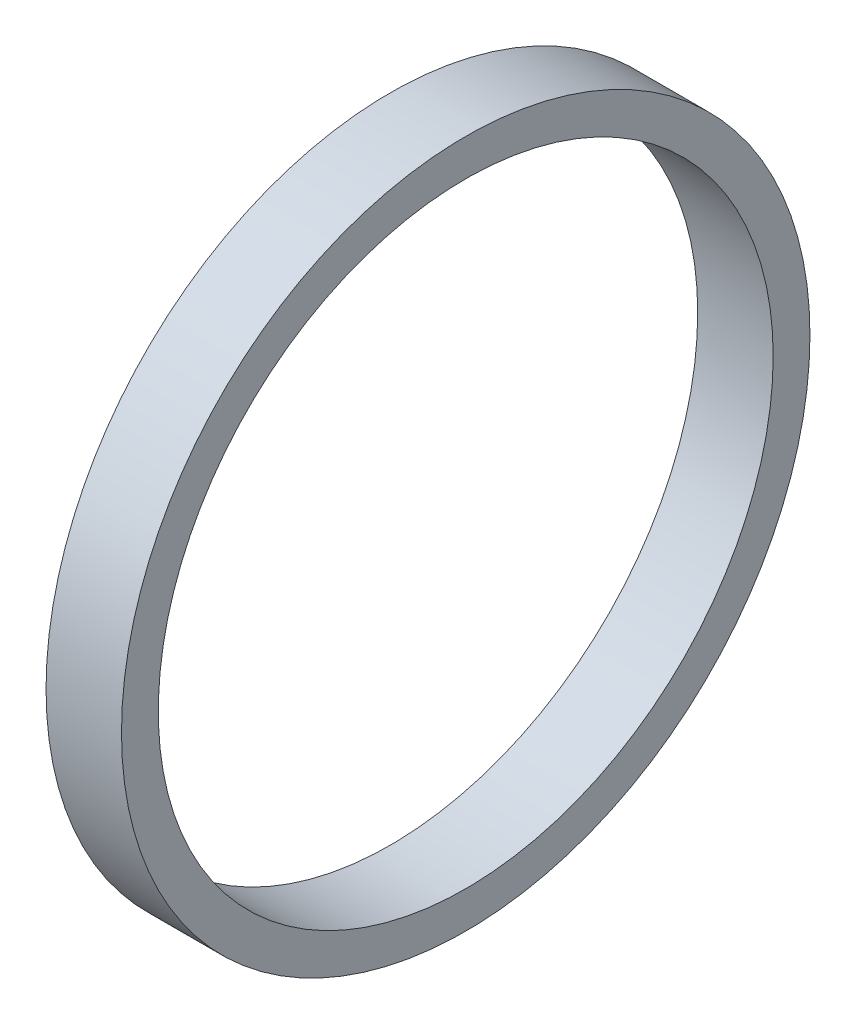
ISO-10303-21;
HEADER;
FILE_DESCRIPTION(('STEP AP214'),'2;1');
FILE_NAME('part.step','',(''),(''),'','','');
FILE_SCHEMA(('AUTOMOTIVE_DESIGN { 1 0 10303 214 1 1 1 1 }'));
ENDSEC;
DATA;
#1=APPLICATION_CONTEXT('core data for automotive mechanical design processes');
#2=APPLICATION_PROTOCOL_DEFINITION('international standard','automotive_design',2000,#1);
#3=PRODUCT_CONTEXT('',#1,'mechanical');
#4=PRODUCT('Part','Part','',(#3));
#5=PRODUCT_RELATED_PRODUCT_CATEGORY('part','',(#4));
#6=PRODUCT_DEFINITION_FORMATION('','',#4);
#7=PRODUCT_DEFINITION_CONTEXT('part definition',#1,'design');
#8=PRODUCT_DEFINITION('design','',#6,#7);
#9=PRODUCT_DEFINITION_SHAPE('','',#8);
#10=(LENGTH_UNIT() NAMED_UNIT(*) SI_UNIT(.MILLI.,.METRE.));
#11=(NAMED_UNIT(*) PLANE_ANGLE_UNIT() SI_UNIT($,.RADIAN.));
#12=(NAMED_UNIT(*) SI_UNIT($,.STERADIAN.) SOLID_ANGLE_UNIT());
#13=UNCERTAINTY_MEASURE_WITH_UNIT(LENGTH_MEASURE(1.E-05),#10,'distance_accuracy_value','');
#14=(GEOMETRIC_REPRESENTATION_CONTEXT(3) GLOBAL_UNCERTAINTY_ASSIGNED_CONTEXT((#13)) GLOBAL_UNIT_ASSIGNED_CONTEXT((#10,
#11,#12)) REPRESENTATION_CONTEXT('',''));
#15=CARTESIAN_POINT('',(0.,0.,0.));
#16=DIRECTION('',(0.,0.,1.));
#17=DIRECTION('',(1.,0.,0.));
#18=AXIS2_PLACEMENT_3D('',#15,#16,#17);
#19=CARTESIAN_POINT('',(8.,0.,0.));
#20=DIRECTION('',(1.,0.,0.));
#21=DIRECTION('',(0.,0.,-1.));
#22=AXIS2_PLACEMENT_3D('',#19,#20,#21);
#23=PLANE('',#22);
#24=CARTESIAN_POINT('',(8.,0.,0.));
#25=DIRECTION('',(1.,0.,0.));
#26=DIRECTION('',(0.,0.,-1.));
#27=AXIS2_PLACEMENT_3D('',#24,#25,#26);
#28=CIRCLE('',#27,36.5);
#29=CARTESIAN_POINT('',(8.,0.,-36.5));
#30=VERTEX_POINT('',#29);
#31=EDGE_CURVE('E10',#30,#30,#28,.T.);
#32=ORIENTED_EDGE('',*,*,#31,.T.);
#33=EDGE_LOOP('',(#32));
#34=FACE_BOUND('',#33,.T.);
#35=CARTESIAN_POINT('',(8.,0.,0.));
#36=DIRECTION('',(1.,0.,0.));
#37=DIRECTION('',(0.,0.,-1.));
#38=AXIS2_PLACEMENT_3D('',#35,#36,#37);
#39=CIRCLE('',#38,32.6);
#40=CARTESIAN_POINT('',(8.,0.,-32.6));
#41=VERTEX_POINT('',#40);
#42=EDGE_CURVE('E48',#41,#41,#39,.T.);
#43=ORIENTED_EDGE('',*,*,#42,.F.);
#44=EDGE_LOOP('',(#43));
#45=FACE_BOUND('',#44,.T.);
#46=ADVANCED_FACE('F37',(#34,#45),#23,.T.);
#47=CARTESIAN_POINT('',(0.,0.,0.));
#48=DIRECTION('',(1.,0.,0.));
#49=DIRECTION('',(0.,0.,-1.));
#50=AXIS2_PLACEMENT_3D('',#47,#48,#49);
#51=PLANE('',#50);
#52=CARTESIAN_POINT('',(0.,0.,0.));
#53=DIRECTION('',(1.,0.,0.));
#54=DIRECTION('',(0.,0.,-1.));
#55=AXIS2_PLACEMENT_3D('',#52,#53,#54);
#56=CIRCLE('',#55,36.5);
#57=CARTESIAN_POINT('',(0.,0.,-36.5));
#58=VERTEX_POINT('',#57);
#59=EDGE_CURVE('E41',#58,#58,#56,.T.);
#60=ORIENTED_EDGE('',*,*,#59,.F.);
#61=EDGE_LOOP('',(#60));
#62=FACE_BOUND('',#61,.T.);
#63=CARTESIAN_POINT('',(0.,0.,0.));
#64=DIRECTION('',(1.,0.,0.));
#65=DIRECTION('',(0.,0.,-1.));
#66=AXIS2_PLACEMENT_3D('',#63,#64,#65);
#67=CIRCLE('',#66,32.6);
#68=CARTESIAN_POINT('',(0.,0.,-32.6));
#69=VERTEX_POINT('',#68);
#70=EDGE_CURVE('E50',#69,#69,#67,.T.);
#71=ORIENTED_EDGE('',*,*,#70,.T.);
#72=EDGE_LOOP('',(#71));
#73=FACE_BOUND('',#72,.T.);
#74=ADVANCED_FACE('F60',(#62,#73),#51,.F.);
#75=CARTESIAN_POINT('',(8.,0.,0.));
#76=DIRECTION('',(-1.,0.,0.));
#77=DIRECTION('',(0.,0.,1.));
#78=AXIS2_PLACEMENT_3D('',#75,#76,#77);
#79=CYLINDRICAL_SURFACE('',#78,36.5);
#80=ORIENTED_EDGE('',*,*,#31,.F.);
#81=EDGE_LOOP('',(#80));
#82=FACE_BOUND('',#81,.T.);
#83=ORIENTED_EDGE('',*,*,#59,.T.);
#84=EDGE_LOOP('',(#83));
#85=FACE_BOUND('',#84,.T.);
#86=ADVANCED_FACE('F39',(#82,#85),#79,.T.);
#87=CARTESIAN_POINT('',(8.,0.,0.));
#88=DIRECTION('',(-1.,0.,0.));
#89=DIRECTION('',(0.,0.,1.));
#90=AXIS2_PLACEMENT_3D('',#87,#88,#89);
#91=CYLINDRICAL_SURFACE('',#90,32.6);
#92=ORIENTED_EDGE('',*,*,#42,.T.);
#93=EDGE_LOOP('',(#92));
#94=FACE_BOUND('',#93,.T.);
#95=ORIENTED_EDGE('',*,*,#70,.F.);
#96=EDGE_LOOP('',(#95));
#97=FACE_BOUND('',#96,.T.);
#98=ADVANCED_FACE('F56',(#94,#97),#91,.F.);
#99=CLOSED_SHELL('',(#46,#74,#86,#98));
#100=MANIFOLD_SOLID_BREP('B2',#99);
#101=ADVANCED_BREP_SHAPE_REPRESENTATION('',(#18,#100),#14);
#102=SHAPE_DEFINITION_REPRESENTATION(#9,#101);
ENDSEC;
END-ISO-10303-21;
